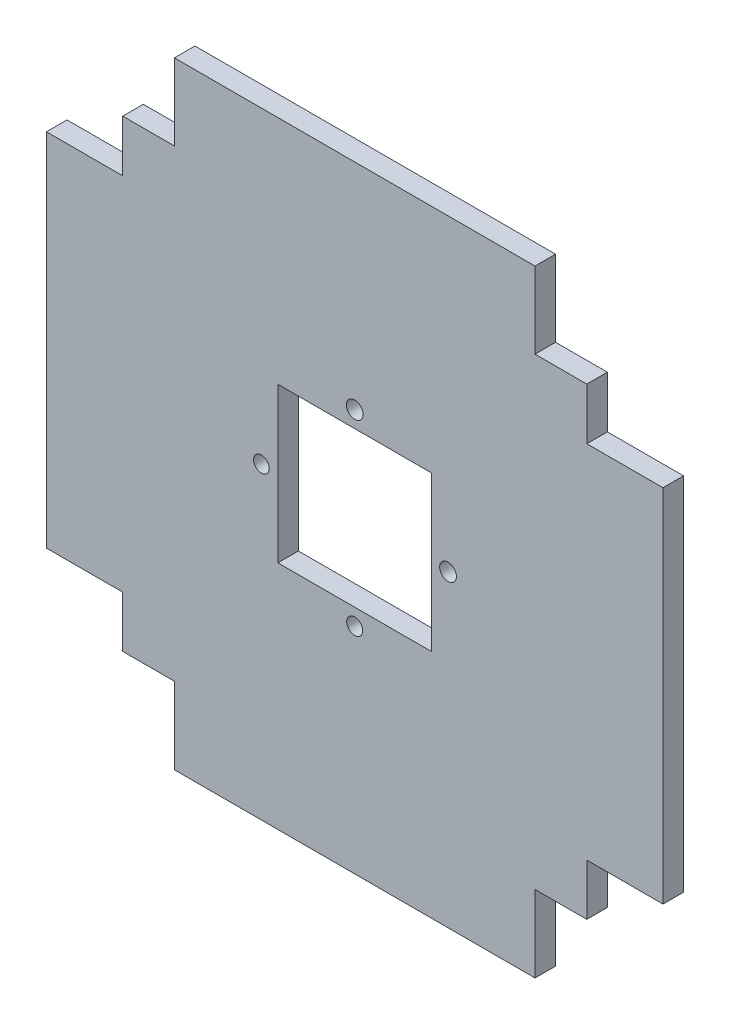
ISO-10303-21;
HEADER;
FILE_DESCRIPTION(('STEP AP214'),'2;1');
FILE_NAME('part.step','',(''),(''),'','','');
FILE_SCHEMA(('AUTOMOTIVE_DESIGN { 1 0 10303 214 1 1 1 1 }'));
ENDSEC;
DATA;
#1=APPLICATION_CONTEXT('core data for automotive mechanical design processes');
#2=APPLICATION_PROTOCOL_DEFINITION('international standard','automotive_design',2000,#1);
#3=PRODUCT_CONTEXT('',#1,'mechanical');
#4=PRODUCT('Part','Part','',(#3));
#5=PRODUCT_RELATED_PRODUCT_CATEGORY('part','',(#4));
#6=PRODUCT_DEFINITION_FORMATION('','',#4);
#7=PRODUCT_DEFINITION_CONTEXT('part definition',#1,'design');
#8=PRODUCT_DEFINITION('design','',#6,#7);
#9=PRODUCT_DEFINITION_SHAPE('','',#8);
#10=(LENGTH_UNIT() NAMED_UNIT(*) SI_UNIT(.MILLI.,.METRE.));
#11=(NAMED_UNIT(*) PLANE_ANGLE_UNIT() SI_UNIT($,.RADIAN.));
#12=(NAMED_UNIT(*) SI_UNIT($,.STERADIAN.) SOLID_ANGLE_UNIT());
#13=UNCERTAINTY_MEASURE_WITH_UNIT(LENGTH_MEASURE(1.E-05),#10,'distance_accuracy_value','');
#14=(GEOMETRIC_REPRESENTATION_CONTEXT(3) GLOBAL_UNCERTAINTY_ASSIGNED_CONTEXT((#13)) GLOBAL_UNIT_ASSIGNED_CONTEXT((#10,
#11,#12)) REPRESENTATION_CONTEXT('',''));
#15=CARTESIAN_POINT('',(0.,0.,0.));
#16=DIRECTION('',(0.,0.,1.));
#17=DIRECTION('',(1.,0.,0.));
#18=AXIS2_PLACEMENT_3D('',#15,#16,#17);
#19=CARTESIAN_POINT('',(0.,0.,5.08));
#20=DIRECTION('',(0.,0.,1.));
#21=DIRECTION('',(1.,0.,0.));
#22=AXIS2_PLACEMENT_3D('',#19,#20,#21);
#23=PLANE('',#22);
#24=CARTESIAN_POINT('',(21.0839098886367,-11.4071856287425,5.08));
#25=DIRECTION('',(0.,0.,1.));
#26=DIRECTION('',(1.,0.,0.));
#27=AXIS2_PLACEMENT_3D('',#24,#25,#26);
#28=CIRCLE('',#27,2.0747905438348);
#29=CARTESIAN_POINT('',(23.1587004324715,-11.4071856287425,5.08));
#30=VERTEX_POINT('',#29);
#31=EDGE_CURVE('E733',#30,#30,#28,.T.);
#32=ORIENTED_EDGE('',*,*,#31,.F.);
#33=EDGE_LOOP('',(#32));
#34=FACE_BOUND('',#33,.T.);
#35=CARTESIAN_POINT('',(-25.0384009066008,-11.4071856287425,5.08));
#36=DIRECTION('',(0.,0.,1.));
#37=DIRECTION('',(1.,0.,0.));
#38=AXIS2_PLACEMENT_3D('',#35,#36,#37);
#39=CIRCLE('',#38,1.93213059452219);
#40=CARTESIAN_POINT('',(-23.1062703120786,-11.4071856287425,5.08));
#41=VERTEX_POINT('',#40);
#42=EDGE_CURVE('E223',#41,#41,#39,.T.);
#43=ORIENTED_EDGE('',*,*,#42,.F.);
#44=EDGE_LOOP('',(#43));
#45=FACE_BOUND('',#44,.T.);
#46=DIRECTION('',(0.,-1.,0.));
#47=VECTOR('',#46,1.);
#48=CARTESIAN_POINT('',(-59.3173652694611,33.1568862275449,5.08));
#49=LINE('',#48,#47);
#50=CARTESIAN_POINT('',(-59.3173652694611,45.9329341317365,5.08));
#51=VERTEX_POINT('',#50);
#52=CARTESIAN_POINT('',(-59.3173652694611,33.1568862275449,5.08));
#53=VERTEX_POINT('',#52);
#54=EDGE_CURVE('E233',#51,#53,#49,.T.);
#55=ORIENTED_EDGE('',*,*,#54,.T.);
#56=DIRECTION('',(-1.,0.,0.));
#57=VECTOR('',#56,1.);
#58=CARTESIAN_POINT('',(-78.1772455089821,33.1568862275449,5.08));
#59=LINE('',#58,#57);
#60=CARTESIAN_POINT('',(-78.1772455089821,33.1568862275449,5.08));
#61=VERTEX_POINT('',#60);
#62=EDGE_CURVE('E236',#53,#61,#59,.T.);
#63=ORIENTED_EDGE('',*,*,#62,.T.);
#64=DIRECTION('',(0.,-1.,0.));
#65=VECTOR('',#64,1.);
#66=CARTESIAN_POINT('',(-78.1772455089821,33.1568862275449,5.08));
#67=LINE('',#66,#65);
#68=CARTESIAN_POINT('',(-78.177245508982,-55.97125748503,5.08));
#69=VERTEX_POINT('',#68);
#70=EDGE_CURVE('E239',#61,#69,#67,.T.);
#71=ORIENTED_EDGE('',*,*,#70,.T.);
#72=DIRECTION('',(1.,0.,0.));
#73=VECTOR('',#72,1.);
#74=CARTESIAN_POINT('',(-78.177245508982,-55.97125748503,5.08));
#75=LINE('',#74,#73);
#76=CARTESIAN_POINT('',(-59.3173652694611,-55.97125748503,5.08));
#77=VERTEX_POINT('',#76);
#78=EDGE_CURVE('E241',#69,#77,#75,.T.);
#79=ORIENTED_EDGE('',*,*,#78,.T.);
#80=DIRECTION('',(0.,-1.,0.));
#81=VECTOR('',#80,1.);
#82=CARTESIAN_POINT('',(-59.3173652694611,-55.97125748503,5.08));
#83=LINE('',#82,#81);
#84=CARTESIAN_POINT('',(-59.3173652694611,-68.6523332378443,5.08));
#85=VERTEX_POINT('',#84);
#86=EDGE_CURVE('E243',#77,#85,#83,.T.);
#87=ORIENTED_EDGE('',*,*,#86,.T.);
#88=DIRECTION('',(1.,0.,0.));
#89=VECTOR('',#88,1.);
#90=CARTESIAN_POINT('',(-46.5413173652695,-68.6523332378443,5.08));
#91=LINE('',#90,#89);
#92=CARTESIAN_POINT('',(-46.5413173652695,-68.6523332378443,5.08));
#93=VERTEX_POINT('',#92);
#94=EDGE_CURVE('E245',#85,#93,#91,.T.);
#95=ORIENTED_EDGE('',*,*,#94,.T.);
#96=DIRECTION('',(0.,-1.,0.));
#97=VECTOR('',#96,1.);
#98=CARTESIAN_POINT('',(-46.5413173652695,-87.6071856287425,5.08));
#99=LINE('',#98,#97);
#100=CARTESIAN_POINT('',(-46.5413173652695,-87.6071856287425,5.08));
#101=VERTEX_POINT('',#100);
#102=EDGE_CURVE('E247',#93,#101,#99,.T.);
#103=ORIENTED_EDGE('',*,*,#102,.T.);
#104=DIRECTION('',(1.,0.,0.));
#105=VECTOR('',#104,1.);
#106=CARTESIAN_POINT('',(-46.5413173652695,-87.6071856287425,5.08));
#107=LINE('',#106,#105);
#108=CARTESIAN_POINT('',(42.5868263473054,-87.6071856287425,5.08));
#109=VERTEX_POINT('',#108);
#110=EDGE_CURVE('E249',#101,#109,#107,.T.);
#111=ORIENTED_EDGE('',*,*,#110,.T.);
#112=DIRECTION('',(0.,1.,0.));
#113=VECTOR('',#112,1.);
#114=CARTESIAN_POINT('',(42.5868263473054,-87.6071856287425,5.08));
#115=LINE('',#114,#113);
#116=CARTESIAN_POINT('',(42.5868263473054,-68.6523332378443,5.08));
#117=VERTEX_POINT('',#116);
#118=EDGE_CURVE('E251',#109,#117,#115,.T.);
#119=ORIENTED_EDGE('',*,*,#118,.T.);
#120=DIRECTION('',(1.,0.,0.));
#121=VECTOR('',#120,1.);
#122=CARTESIAN_POINT('',(42.5868263473054,-68.6523332378443,5.08));
#123=LINE('',#122,#121);
#124=CARTESIAN_POINT('',(55.3889879002395,-68.6523332378443,5.08));
#125=VERTEX_POINT('',#124);
#126=EDGE_CURVE('E253',#117,#125,#123,.T.);
#127=ORIENTED_EDGE('',*,*,#126,.T.);
#128=DIRECTION('',(0.,1.,0.));
#129=VECTOR('',#128,1.);
#130=CARTESIAN_POINT('',(55.3889879002395,-55.97125748503,5.08));
#131=LINE('',#130,#129);
#132=CARTESIAN_POINT('',(55.3889879002395,-55.97125748503,5.08));
#133=VERTEX_POINT('',#132);
#134=EDGE_CURVE('E255',#125,#133,#131,.T.);
#135=ORIENTED_EDGE('',*,*,#134,.T.);
#136=DIRECTION('',(1.,0.,0.));
#137=VECTOR('',#136,1.);
#138=CARTESIAN_POINT('',(74.222754491018,-55.97125748503,5.08));
#139=LINE('',#138,#137);
#140=CARTESIAN_POINT('',(74.222754491018,-55.97125748503,5.08));
#141=VERTEX_POINT('',#140);
#142=EDGE_CURVE('E257',#133,#141,#139,.T.);
#143=ORIENTED_EDGE('',*,*,#142,.T.);
#144=DIRECTION('',(0.,1.,0.));
#145=VECTOR('',#144,1.);
#146=CARTESIAN_POINT('',(74.222754491018,33.1568862275449,5.08));
#147=LINE('',#146,#145);
#148=CARTESIAN_POINT('',(74.222754491018,33.1568862275449,5.08));
#149=VERTEX_POINT('',#148);
#150=EDGE_CURVE('E259',#141,#149,#147,.T.);
#151=ORIENTED_EDGE('',*,*,#150,.T.);
#152=DIRECTION('',(-1.,0.,0.));
#153=VECTOR('',#152,1.);
#154=CARTESIAN_POINT('',(74.222754491018,33.1568862275449,5.08));
#155=LINE('',#154,#153);
#156=CARTESIAN_POINT('',(55.3889879002395,33.1568862275449,5.08));
#157=VERTEX_POINT('',#156);
#158=EDGE_CURVE('E261',#149,#157,#155,.T.);
#159=ORIENTED_EDGE('',*,*,#158,.T.);
#160=DIRECTION('',(0.,1.,0.));
#161=VECTOR('',#160,1.);
#162=CARTESIAN_POINT('',(55.3889879002395,33.1568862275449,5.08));
#163=LINE('',#162,#161);
#164=CARTESIAN_POINT('',(55.3889879002395,45.9329341317365,5.08));
#165=VERTEX_POINT('',#164);
#166=EDGE_CURVE('E263',#157,#165,#163,.T.);
#167=ORIENTED_EDGE('',*,*,#166,.T.);
#168=DIRECTION('',(-1.,0.,0.));
#169=VECTOR('',#168,1.);
#170=CARTESIAN_POINT('',(42.5868263473054,45.9329341317365,5.08));
#171=LINE('',#170,#169);
#172=CARTESIAN_POINT('',(42.5868263473054,45.9329341317365,5.08));
#173=VERTEX_POINT('',#172);
#174=EDGE_CURVE('E265',#165,#173,#171,.T.);
#175=ORIENTED_EDGE('',*,*,#174,.T.);
#176=DIRECTION('',(0.,1.,0.));
#177=VECTOR('',#176,1.);
#178=CARTESIAN_POINT('',(42.5868263473054,64.7928143712575,5.08));
#179=LINE('',#178,#177);
#180=CARTESIAN_POINT('',(42.5868263473054,64.7928143712575,5.08));
#181=VERTEX_POINT('',#180);
#182=EDGE_CURVE('E267',#173,#181,#179,.T.);
#183=ORIENTED_EDGE('',*,*,#182,.T.);
#184=DIRECTION('',(-1.,0.,0.));
#185=VECTOR('',#184,1.);
#186=CARTESIAN_POINT('',(-46.5413173652695,64.7928143712575,5.08));
#187=LINE('',#186,#185);
#188=CARTESIAN_POINT('',(-46.5413173652695,64.7928143712575,5.08));
#189=VERTEX_POINT('',#188);
#190=EDGE_CURVE('E269',#181,#189,#187,.T.);
#191=ORIENTED_EDGE('',*,*,#190,.T.);
#192=DIRECTION('',(0.,-1.,0.));
#193=VECTOR('',#192,1.);
#194=CARTESIAN_POINT('',(-46.5413173652695,64.7928143712575,5.08));
#195=LINE('',#194,#193);
#196=CARTESIAN_POINT('',(-46.5413173652695,45.9329341317365,5.08));
#197=VERTEX_POINT('',#196);
#198=EDGE_CURVE('E271',#189,#197,#195,.T.);
#199=ORIENTED_EDGE('',*,*,#198,.T.);
#200=DIRECTION('',(-1.,0.,0.));
#201=VECTOR('',#200,1.);
#202=CARTESIAN_POINT('',(-46.5413173652695,45.9329341317365,5.08));
#203=LINE('',#202,#201);
#204=EDGE_CURVE('E273',#197,#51,#203,.T.);
#205=ORIENTED_EDGE('',*,*,#204,.T.);
#206=EDGE_LOOP('',(#55,#63,#71,#79,#87,#95,#103,#111,#119,#127,#135,#143,#151,#159,#167,#175,
#183,#191,#199,#205));
#207=FACE_BOUND('',#206,.T.);
#208=DIRECTION('',(-1.,0.,0.));
#209=VECTOR('',#208,1.);
#210=CARTESIAN_POINT('',(-20.9744009066008,7.70580608227633,5.08));
#211=LINE('',#210,#209);
#212=CARTESIAN_POINT('',(17.0199098886367,7.70580608227633,5.08));
#213=VERTEX_POINT('',#212);
#214=CARTESIAN_POINT('',(-20.9744009066008,7.70580608227633,5.08));
#215=VERTEX_POINT('',#214);
#216=EDGE_CURVE('E202',#213,#215,#211,.T.);
#217=ORIENTED_EDGE('',*,*,#216,.F.);
#218=DIRECTION('',(0.,1.,0.));
#219=VECTOR('',#218,1.);
#220=CARTESIAN_POINT('',(17.0199098886367,7.70580608227633,5.08));
#221=LINE('',#220,#219);
#222=CARTESIAN_POINT('',(17.0199098886367,-30.5201773397614,5.08));
#223=VERTEX_POINT('',#222);
#224=EDGE_CURVE('E194',#223,#213,#221,.T.);
#225=ORIENTED_EDGE('',*,*,#224,.F.);
#226=DIRECTION('',(1.,0.,0.));
#227=VECTOR('',#226,1.);
#228=CARTESIAN_POINT('',(-20.9744009066008,-30.5201773397614,5.08));
#229=LINE('',#228,#227);
#230=CARTESIAN_POINT('',(-20.9744009066008,-30.5201773397614,5.08));
#231=VERTEX_POINT('',#230);
#232=EDGE_CURVE('E217',#231,#223,#229,.T.);
#233=ORIENTED_EDGE('',*,*,#232,.F.);
#234=DIRECTION('',(0.,-1.,0.));
#235=VECTOR('',#234,1.);
#236=CARTESIAN_POINT('',(-20.9744009066008,7.70580608227633,5.08));
#237=LINE('',#236,#235);
#238=EDGE_CURVE('E215',#215,#231,#237,.T.);
#239=ORIENTED_EDGE('',*,*,#238,.F.);
#240=EDGE_LOOP('',(#217,#225,#233,#239));
#241=FACE_BOUND('',#240,.T.);
#242=CARTESIAN_POINT('',(-1.97724550898205,11.7698060822763,5.08));
#243=DIRECTION('',(0.,0.,1.));
#244=DIRECTION('',(1.,0.,0.));
#245=AXIS2_PLACEMENT_3D('',#242,#243,#244);
#246=CIRCLE('',#245,2.077751344082);
#247=CARTESIAN_POINT('',(0.100505835099948,11.7698060822763,5.08));
#248=VERTEX_POINT('',#247);
#249=EDGE_CURVE('E739',#248,#248,#246,.T.);
#250=ORIENTED_EDGE('',*,*,#249,.F.);
#251=EDGE_LOOP('',(#250));
#252=FACE_BOUND('',#251,.T.);
#253=CARTESIAN_POINT('',(-1.97724550898205,-34.5841773397614,5.08));
#254=DIRECTION('',(0.,0.,1.));
#255=DIRECTION('',(1.,0.,0.));
#256=AXIS2_PLACEMENT_3D('',#253,#254,#255);
#257=CIRCLE('',#256,1.97724550898205);
#258=CARTESIAN_POINT('',(0.,-34.5841773397614,5.08));
#259=VERTEX_POINT('',#258);
#260=EDGE_CURVE('E724',#259,#259,#257,.T.);
#261=ORIENTED_EDGE('',*,*,#260,.F.);
#262=EDGE_LOOP('',(#261));
#263=FACE_BOUND('',#262,.T.);
#264=ADVANCED_FACE('F33',(#34,#45,#207,#241,#252,#263),#23,.T.);
#265=CARTESIAN_POINT('',(0.,0.,0.));
#266=DIRECTION('',(0.,0.,1.));
#267=DIRECTION('',(1.,0.,0.));
#268=AXIS2_PLACEMENT_3D('',#265,#266,#267);
#269=PLANE('',#268);
#270=DIRECTION('',(0.,-1.,0.));
#271=VECTOR('',#270,1.);
#272=CARTESIAN_POINT('',(-59.3173652694611,33.1568862275449,0.));
#273=LINE('',#272,#271);
#274=CARTESIAN_POINT('',(-59.3173652694611,45.9329341317365,0.));
#275=VERTEX_POINT('',#274);
#276=CARTESIAN_POINT('',(-59.3173652694611,33.1568862275449,0.));
#277=VERTEX_POINT('',#276);
#278=EDGE_CURVE('E210',#275,#277,#273,.T.);
#279=ORIENTED_EDGE('',*,*,#278,.F.);
#280=DIRECTION('',(-1.,0.,0.));
#281=VECTOR('',#280,1.);
#282=CARTESIAN_POINT('',(-46.5413173652695,45.9329341317365,0.));
#283=LINE('',#282,#281);
#284=CARTESIAN_POINT('',(-46.5413173652695,45.9329341317365,0.));
#285=VERTEX_POINT('',#284);
#286=EDGE_CURVE('E237',#285,#275,#283,.T.);
#287=ORIENTED_EDGE('',*,*,#286,.F.);
#288=DIRECTION('',(0.,-1.,0.));
#289=VECTOR('',#288,1.);
#290=CARTESIAN_POINT('',(-46.5413173652695,64.7928143712575,0.));
#291=LINE('',#290,#289);
#292=CARTESIAN_POINT('',(-46.5413173652695,64.7928143712575,0.));
#293=VERTEX_POINT('',#292);
#294=EDGE_CURVE('E312',#293,#285,#291,.T.);
#295=ORIENTED_EDGE('',*,*,#294,.F.);
#296=DIRECTION('',(-1.,0.,0.));
#297=VECTOR('',#296,1.);
#298=CARTESIAN_POINT('',(-46.5413173652695,64.7928143712575,0.));
#299=LINE('',#298,#297);
#300=CARTESIAN_POINT('',(42.5868263473054,64.7928143712575,0.));
#301=VERTEX_POINT('',#300);
#302=EDGE_CURVE('E310',#301,#293,#299,.T.);
#303=ORIENTED_EDGE('',*,*,#302,.F.);
#304=DIRECTION('',(0.,1.,0.));
#305=VECTOR('',#304,1.);
#306=CARTESIAN_POINT('',(42.5868263473054,64.7928143712575,0.));
#307=LINE('',#306,#305);
#308=CARTESIAN_POINT('',(42.5868263473054,45.9329341317365,0.));
#309=VERTEX_POINT('',#308);
#310=EDGE_CURVE('E308',#309,#301,#307,.T.);
#311=ORIENTED_EDGE('',*,*,#310,.F.);
#312=DIRECTION('',(-1.,0.,0.));
#313=VECTOR('',#312,1.);
#314=CARTESIAN_POINT('',(42.5868263473054,45.9329341317365,0.));
#315=LINE('',#314,#313);
#316=CARTESIAN_POINT('',(55.3889879002395,45.9329341317365,0.));
#317=VERTEX_POINT('',#316);
#318=EDGE_CURVE('E306',#317,#309,#315,.T.);
#319=ORIENTED_EDGE('',*,*,#318,.F.);
#320=DIRECTION('',(0.,1.,0.));
#321=VECTOR('',#320,1.);
#322=CARTESIAN_POINT('',(55.3889879002395,33.1568862275449,0.));
#323=LINE('',#322,#321);
#324=CARTESIAN_POINT('',(55.3889879002395,33.1568862275449,0.));
#325=VERTEX_POINT('',#324);
#326=EDGE_CURVE('E304',#325,#317,#323,.T.);
#327=ORIENTED_EDGE('',*,*,#326,.F.);
#328=DIRECTION('',(-1.,0.,0.));
#329=VECTOR('',#328,1.);
#330=CARTESIAN_POINT('',(74.222754491018,33.1568862275449,0.));
#331=LINE('',#330,#329);
#332=CARTESIAN_POINT('',(74.222754491018,33.1568862275449,0.));
#333=VERTEX_POINT('',#332);
#334=EDGE_CURVE('E302',#333,#325,#331,.T.);
#335=ORIENTED_EDGE('',*,*,#334,.F.);
#336=DIRECTION('',(0.,1.,0.));
#337=VECTOR('',#336,1.);
#338=CARTESIAN_POINT('',(74.222754491018,33.1568862275449,0.));
#339=LINE('',#338,#337);
#340=CARTESIAN_POINT('',(74.222754491018,-55.97125748503,0.));
#341=VERTEX_POINT('',#340);
#342=EDGE_CURVE('E300',#341,#333,#339,.T.);
#343=ORIENTED_EDGE('',*,*,#342,.F.);
#344=DIRECTION('',(1.,0.,0.));
#345=VECTOR('',#344,1.);
#346=CARTESIAN_POINT('',(74.222754491018,-55.97125748503,0.));
#347=LINE('',#346,#345);
#348=CARTESIAN_POINT('',(55.3889879002395,-55.97125748503,0.));
#349=VERTEX_POINT('',#348);
#350=EDGE_CURVE('E298',#349,#341,#347,.T.);
#351=ORIENTED_EDGE('',*,*,#350,.F.);
#352=DIRECTION('',(0.,1.,0.));
#353=VECTOR('',#352,1.);
#354=CARTESIAN_POINT('',(55.3889879002395,-55.97125748503,0.));
#355=LINE('',#354,#353);
#356=CARTESIAN_POINT('',(55.3889879002395,-68.6523332378443,0.));
#357=VERTEX_POINT('',#356);
#358=EDGE_CURVE('E296',#357,#349,#355,.T.);
#359=ORIENTED_EDGE('',*,*,#358,.F.);
#360=DIRECTION('',(1.,0.,0.));
#361=VECTOR('',#360,1.);
#362=CARTESIAN_POINT('',(42.5868263473054,-68.6523332378443,0.));
#363=LINE('',#362,#361);
#364=CARTESIAN_POINT('',(42.5868263473054,-68.6523332378443,0.));
#365=VERTEX_POINT('',#364);
#366=EDGE_CURVE('E294',#365,#357,#363,.T.);
#367=ORIENTED_EDGE('',*,*,#366,.F.);
#368=DIRECTION('',(0.,1.,0.));
#369=VECTOR('',#368,1.);
#370=CARTESIAN_POINT('',(42.5868263473054,-87.6071856287425,0.));
#371=LINE('',#370,#369);
#372=CARTESIAN_POINT('',(42.5868263473054,-87.6071856287425,0.));
#373=VERTEX_POINT('',#372);
#374=EDGE_CURVE('E292',#373,#365,#371,.T.);
#375=ORIENTED_EDGE('',*,*,#374,.F.);
#376=DIRECTION('',(1.,0.,0.));
#377=VECTOR('',#376,1.);
#378=CARTESIAN_POINT('',(-46.5413173652695,-87.6071856287425,0.));
#379=LINE('',#378,#377);
#380=CARTESIAN_POINT('',(-46.5413173652695,-87.6071856287425,0.));
#381=VERTEX_POINT('',#380);
#382=EDGE_CURVE('E290',#381,#373,#379,.T.);
#383=ORIENTED_EDGE('',*,*,#382,.F.);
#384=DIRECTION('',(0.,-1.,0.));
#385=VECTOR('',#384,1.);
#386=CARTESIAN_POINT('',(-46.5413173652695,-87.6071856287425,0.));
#387=LINE('',#386,#385);
#388=CARTESIAN_POINT('',(-46.5413173652695,-68.6523332378443,0.));
#389=VERTEX_POINT('',#388);
#390=EDGE_CURVE('E288',#389,#381,#387,.T.);
#391=ORIENTED_EDGE('',*,*,#390,.F.);
#392=DIRECTION('',(1.,0.,0.));
#393=VECTOR('',#392,1.);
#394=CARTESIAN_POINT('',(-46.5413173652695,-68.6523332378443,0.));
#395=LINE('',#394,#393);
#396=CARTESIAN_POINT('',(-59.3173652694611,-68.6523332378443,0.));
#397=VERTEX_POINT('',#396);
#398=EDGE_CURVE('E286',#397,#389,#395,.T.);
#399=ORIENTED_EDGE('',*,*,#398,.F.);
#400=DIRECTION('',(0.,-1.,0.));
#401=VECTOR('',#400,1.);
#402=CARTESIAN_POINT('',(-59.3173652694611,-55.97125748503,0.));
#403=LINE('',#402,#401);
#404=CARTESIAN_POINT('',(-59.3173652694611,-55.97125748503,0.));
#405=VERTEX_POINT('',#404);
#406=EDGE_CURVE('E284',#405,#397,#403,.T.);
#407=ORIENTED_EDGE('',*,*,#406,.F.);
#408=DIRECTION('',(1.,0.,0.));
#409=VECTOR('',#408,1.);
#410=CARTESIAN_POINT('',(-78.177245508982,-55.97125748503,0.));
#411=LINE('',#410,#409);
#412=CARTESIAN_POINT('',(-78.177245508982,-55.97125748503,0.));
#413=VERTEX_POINT('',#412);
#414=EDGE_CURVE('E282',#413,#405,#411,.T.);
#415=ORIENTED_EDGE('',*,*,#414,.F.);
#416=DIRECTION('',(0.,-1.,0.));
#417=VECTOR('',#416,1.);
#418=CARTESIAN_POINT('',(-78.1772455089821,33.1568862275449,0.));
#419=LINE('',#418,#417);
#420=CARTESIAN_POINT('',(-78.1772455089821,33.1568862275449,0.));
#421=VERTEX_POINT('',#420);
#422=EDGE_CURVE('E280',#421,#413,#419,.T.);
#423=ORIENTED_EDGE('',*,*,#422,.F.);
#424=DIRECTION('',(-1.,0.,0.));
#425=VECTOR('',#424,1.);
#426=CARTESIAN_POINT('',(-78.1772455089821,33.1568862275449,0.));
#427=LINE('',#426,#425);
#428=EDGE_CURVE('E278',#277,#421,#427,.T.);
#429=ORIENTED_EDGE('',*,*,#428,.F.);
#430=EDGE_LOOP('',(#279,#287,#295,#303,#311,#319,#327,#335,#343,#351,#359,#367,#375,#383,#391,
#399,#407,#415,#423,#429));
#431=FACE_BOUND('',#430,.T.);
#432=DIRECTION('',(0.,1.,0.));
#433=VECTOR('',#432,1.);
#434=CARTESIAN_POINT('',(17.0199098886367,7.70580608227633,0.));
#435=LINE('',#434,#433);
#436=CARTESIAN_POINT('',(17.0199098886367,-30.5201773397614,0.));
#437=VERTEX_POINT('',#436);
#438=CARTESIAN_POINT('',(17.0199098886367,7.70580608227633,0.));
#439=VERTEX_POINT('',#438);
#440=EDGE_CURVE('E56',#437,#439,#435,.T.);
#441=ORIENTED_EDGE('',*,*,#440,.T.);
#442=DIRECTION('',(-1.,0.,0.));
#443=VECTOR('',#442,1.);
#444=CARTESIAN_POINT('',(-20.9744009066008,7.70580608227633,0.));
#445=LINE('',#444,#443);
#446=CARTESIAN_POINT('',(-20.9744009066008,7.70580608227633,0.));
#447=VERTEX_POINT('',#446);
#448=EDGE_CURVE('E209',#439,#447,#445,.T.);
#449=ORIENTED_EDGE('',*,*,#448,.T.);
#450=DIRECTION('',(0.,-1.,0.));
#451=VECTOR('',#450,1.);
#452=CARTESIAN_POINT('',(-20.9744009066008,7.70580608227633,0.));
#453=LINE('',#452,#451);
#454=CARTESIAN_POINT('',(-20.9744009066008,-30.5201773397614,0.));
#455=VERTEX_POINT('',#454);
#456=EDGE_CURVE('E225',#447,#455,#453,.T.);
#457=ORIENTED_EDGE('',*,*,#456,.T.);
#458=DIRECTION('',(1.,0.,0.));
#459=VECTOR('',#458,1.);
#460=CARTESIAN_POINT('',(-20.9744009066008,-30.5201773397614,0.));
#461=LINE('',#460,#459);
#462=EDGE_CURVE('E203',#455,#437,#461,.T.);
#463=ORIENTED_EDGE('',*,*,#462,.T.);
#464=EDGE_LOOP('',(#441,#449,#457,#463));
#465=FACE_BOUND('',#464,.T.);
#466=CARTESIAN_POINT('',(-25.0384009066008,-11.4071856287425,0.));
#467=DIRECTION('',(0.,0.,1.));
#468=DIRECTION('',(1.,0.,0.));
#469=AXIS2_PLACEMENT_3D('',#466,#467,#468);
#470=CIRCLE('',#469,1.93213059452219);
#471=CARTESIAN_POINT('',(-23.1062703120786,-11.4071856287425,0.));
#472=VERTEX_POINT('',#471);
#473=EDGE_CURVE('E742',#472,#472,#470,.T.);
#474=ORIENTED_EDGE('',*,*,#473,.T.);
#475=EDGE_LOOP('',(#474));
#476=FACE_BOUND('',#475,.T.);
#477=CARTESIAN_POINT('',(-1.97724550898205,11.7698060822763,0.));
#478=DIRECTION('',(0.,0.,1.));
#479=DIRECTION('',(1.,0.,0.));
#480=AXIS2_PLACEMENT_3D('',#477,#478,#479);
#481=CIRCLE('',#480,2.077751344082);
#482=CARTESIAN_POINT('',(0.100505835099948,11.7698060822763,0.));
#483=VERTEX_POINT('',#482);
#484=EDGE_CURVE('E736',#483,#483,#481,.T.);
#485=ORIENTED_EDGE('',*,*,#484,.T.);
#486=EDGE_LOOP('',(#485));
#487=FACE_BOUND('',#486,.T.);
#488=CARTESIAN_POINT('',(21.0839098886367,-11.4071856287425,0.));
#489=DIRECTION('',(0.,0.,1.));
#490=DIRECTION('',(1.,0.,0.));
#491=AXIS2_PLACEMENT_3D('',#488,#489,#490);
#492=CIRCLE('',#491,2.0747905438348);
#493=CARTESIAN_POINT('',(23.1587004324715,-11.4071856287425,0.));
#494=VERTEX_POINT('',#493);
#495=EDGE_CURVE('E730',#494,#494,#492,.T.);
#496=ORIENTED_EDGE('',*,*,#495,.T.);
#497=EDGE_LOOP('',(#496));
#498=FACE_BOUND('',#497,.T.);
#499=CARTESIAN_POINT('',(-1.97724550898205,-34.5841773397614,0.));
#500=DIRECTION('',(0.,0.,1.));
#501=DIRECTION('',(1.,0.,0.));
#502=AXIS2_PLACEMENT_3D('',#499,#500,#501);
#503=CIRCLE('',#502,1.97724550898205);
#504=CARTESIAN_POINT('',(0.,-34.5841773397614,0.));
#505=VERTEX_POINT('',#504);
#506=EDGE_CURVE('E727',#505,#505,#503,.T.);
#507=ORIENTED_EDGE('',*,*,#506,.T.);
#508=EDGE_LOOP('',(#507));
#509=FACE_BOUND('',#508,.T.);
#510=ADVANCED_FACE('F378',(#431,#465,#476,#487,#498,#509),#269,.F.);
#511=CARTESIAN_POINT('',(-59.3173652694611,33.1568862275449,5.08));
#512=DIRECTION('',(1.,0.,0.));
#513=DIRECTION('',(0.,0.,-1.));
#514=AXIS2_PLACEMENT_3D('',#511,#512,#513);
#515=PLANE('',#514);
#516=ORIENTED_EDGE('',*,*,#278,.T.);
#517=DIRECTION('',(0.,0.,-1.));
#518=VECTOR('',#517,1.);
#519=CARTESIAN_POINT('',(-59.3173652694611,33.1568862275449,5.08));
#520=LINE('',#519,#518);
#521=EDGE_CURVE('E11',#53,#277,#520,.T.);
#522=ORIENTED_EDGE('',*,*,#521,.F.);
#523=ORIENTED_EDGE('',*,*,#54,.F.);
#524=DIRECTION('',(0.,0.,-1.));
#525=VECTOR('',#524,1.);
#526=CARTESIAN_POINT('',(-59.3173652694611,45.9329341317365,5.08));
#527=LINE('',#526,#525);
#528=EDGE_CURVE('E275',#51,#275,#527,.T.);
#529=ORIENTED_EDGE('',*,*,#528,.T.);
#530=EDGE_LOOP('',(#516,#522,#523,#529));
#531=FACE_BOUND('',#530,.T.);
#532=ADVANCED_FACE('F35',(#531),#515,.F.);
#533=CARTESIAN_POINT('',(-78.1772455089821,33.1568862275449,5.08));
#534=DIRECTION('',(0.,-1.,0.));
#535=DIRECTION('',(0.,0.,-1.));
#536=AXIS2_PLACEMENT_3D('',#533,#534,#535);
#537=PLANE('',#536);
#538=ORIENTED_EDGE('',*,*,#428,.T.);
#539=DIRECTION('',(0.,0.,-1.));
#540=VECTOR('',#539,1.);
#541=CARTESIAN_POINT('',(-78.1772455089821,33.1568862275449,5.08));
#542=LINE('',#541,#540);
#543=EDGE_CURVE('E41',#61,#421,#542,.T.);
#544=ORIENTED_EDGE('',*,*,#543,.F.);
#545=ORIENTED_EDGE('',*,*,#62,.F.);
#546=ORIENTED_EDGE('',*,*,#521,.T.);
#547=EDGE_LOOP('',(#538,#544,#545,#546));
#548=FACE_BOUND('',#547,.T.);
#549=ADVANCED_FACE('F395',(#548),#537,.F.);
#550=CARTESIAN_POINT('',(-78.1772455089821,33.1568862275449,5.08));
#551=DIRECTION('',(1.,0.,0.));
#552=DIRECTION('',(0.,1.,0.));
#553=AXIS2_PLACEMENT_3D('',#550,#551,#552);
#554=PLANE('',#553);
#555=ORIENTED_EDGE('',*,*,#422,.T.);
#556=DIRECTION('',(0.,0.,-1.));
#557=VECTOR('',#556,1.);
#558=CARTESIAN_POINT('',(-78.177245508982,-55.97125748503,5.08));
#559=LINE('',#558,#557);
#560=EDGE_CURVE('E365',#69,#413,#559,.T.);
#561=ORIENTED_EDGE('',*,*,#560,.F.);
#562=ORIENTED_EDGE('',*,*,#70,.F.);
#563=ORIENTED_EDGE('',*,*,#543,.T.);
#564=EDGE_LOOP('',(#555,#561,#562,#563));
#565=FACE_BOUND('',#564,.T.);
#566=ADVANCED_FACE('F372',(#565),#554,.F.);
#567=CARTESIAN_POINT('',(-78.177245508982,-55.97125748503,5.08));
#568=DIRECTION('',(0.,1.,0.));
#569=DIRECTION('',(0.,0.,1.));
#570=AXIS2_PLACEMENT_3D('',#567,#568,#569);
#571=PLANE('',#570);
#572=ORIENTED_EDGE('',*,*,#414,.T.);
#573=DIRECTION('',(0.,0.,-1.));
#574=VECTOR('',#573,1.);
#575=CARTESIAN_POINT('',(-59.3173652694611,-55.97125748503,5.08));
#576=LINE('',#575,#574);
#577=EDGE_CURVE('E362',#77,#405,#576,.T.);
#578=ORIENTED_EDGE('',*,*,#577,.F.);
#579=ORIENTED_EDGE('',*,*,#78,.F.);
#580=ORIENTED_EDGE('',*,*,#560,.T.);
#581=EDGE_LOOP('',(#572,#578,#579,#580));
#582=FACE_BOUND('',#581,.T.);
#583=ADVANCED_FACE('F384',(#582),#571,.F.);
#584=CARTESIAN_POINT('',(-59.3173652694611,-55.97125748503,5.08));
#585=DIRECTION('',(1.,0.,0.));
#586=DIRECTION('',(0.,0.,-1.));
#587=AXIS2_PLACEMENT_3D('',#584,#585,#586);
#588=PLANE('',#587);
#589=ORIENTED_EDGE('',*,*,#406,.T.);
#590=DIRECTION('',(0.,0.,-1.));
#591=VECTOR('',#590,1.);
#592=CARTESIAN_POINT('',(-59.3173652694611,-68.6523332378443,5.08));
#593=LINE('',#592,#591);
#594=EDGE_CURVE('E359',#85,#397,#593,.T.);
#595=ORIENTED_EDGE('',*,*,#594,.F.);
#596=ORIENTED_EDGE('',*,*,#86,.F.);
#597=ORIENTED_EDGE('',*,*,#577,.T.);
#598=EDGE_LOOP('',(#589,#595,#596,#597));
#599=FACE_BOUND('',#598,.T.);
#600=ADVANCED_FACE('F388',(#599),#588,.F.);
#601=CARTESIAN_POINT('',(-46.5413173652695,-68.6523332378443,5.08));
#602=DIRECTION('',(0.,1.,0.));
#603=DIRECTION('',(0.,0.,1.));
#604=AXIS2_PLACEMENT_3D('',#601,#602,#603);
#605=PLANE('',#604);
#606=ORIENTED_EDGE('',*,*,#398,.T.);
#607=DIRECTION('',(0.,0.,-1.));
#608=VECTOR('',#607,1.);
#609=CARTESIAN_POINT('',(-46.5413173652695,-68.6523332378443,5.08));
#610=LINE('',#609,#608);
#611=EDGE_CURVE('E356',#93,#389,#610,.T.);
#612=ORIENTED_EDGE('',*,*,#611,.F.);
#613=ORIENTED_EDGE('',*,*,#94,.F.);
#614=ORIENTED_EDGE('',*,*,#594,.T.);
#615=EDGE_LOOP('',(#606,#612,#613,#614));
#616=FACE_BOUND('',#615,.T.);
#617=ADVANCED_FACE('F468',(#616),#605,.F.);
#618=CARTESIAN_POINT('',(-46.5413173652695,-87.6071856287425,5.08));
#619=DIRECTION('',(1.,0.,0.));
#620=DIRECTION('',(0.,0.,-1.));
#621=AXIS2_PLACEMENT_3D('',#618,#619,#620);
#622=PLANE('',#621);
#623=ORIENTED_EDGE('',*,*,#390,.T.);
#624=DIRECTION('',(0.,0.,-1.));
#625=VECTOR('',#624,1.);
#626=CARTESIAN_POINT('',(-46.5413173652695,-87.6071856287425,5.08));
#627=LINE('',#626,#625);
#628=EDGE_CURVE('E353',#101,#381,#627,.T.);
#629=ORIENTED_EDGE('',*,*,#628,.F.);
#630=ORIENTED_EDGE('',*,*,#102,.F.);
#631=ORIENTED_EDGE('',*,*,#611,.T.);
#632=EDGE_LOOP('',(#623,#629,#630,#631));
#633=FACE_BOUND('',#632,.T.);
#634=ADVANCED_FACE('F466',(#633),#622,.F.);
#635=CARTESIAN_POINT('',(-46.5413173652695,-87.6071856287425,5.08));
#636=DIRECTION('',(0.,1.,0.));
#637=DIRECTION('',(0.,0.,1.));
#638=AXIS2_PLACEMENT_3D('',#635,#636,#637);
#639=PLANE('',#638);
#640=ORIENTED_EDGE('',*,*,#382,.T.);
#641=DIRECTION('',(0.,0.,-1.));
#642=VECTOR('',#641,1.);
#643=CARTESIAN_POINT('',(42.5868263473054,-87.6071856287425,5.08));
#644=LINE('',#643,#642);
#645=EDGE_CURVE('E350',#109,#373,#644,.T.);
#646=ORIENTED_EDGE('',*,*,#645,.F.);
#647=ORIENTED_EDGE('',*,*,#110,.F.);
#648=ORIENTED_EDGE('',*,*,#628,.T.);
#649=EDGE_LOOP('',(#640,#646,#647,#648));
#650=FACE_BOUND('',#649,.T.);
#651=ADVANCED_FACE('F461',(#650),#639,.F.);
#652=CARTESIAN_POINT('',(42.5868263473054,-87.6071856287425,5.08));
#653=DIRECTION('',(-1.,0.,0.));
#654=DIRECTION('',(0.,0.,1.));
#655=AXIS2_PLACEMENT_3D('',#652,#653,#654);
#656=PLANE('',#655);
#657=ORIENTED_EDGE('',*,*,#374,.T.);
#658=DIRECTION('',(0.,0.,-1.));
#659=VECTOR('',#658,1.);
#660=CARTESIAN_POINT('',(42.5868263473054,-68.6523332378443,5.08));
#661=LINE('',#660,#659);
#662=EDGE_CURVE('E347',#117,#365,#661,.T.);
#663=ORIENTED_EDGE('',*,*,#662,.F.);
#664=ORIENTED_EDGE('',*,*,#118,.F.);
#665=ORIENTED_EDGE('',*,*,#645,.T.);
#666=EDGE_LOOP('',(#657,#663,#664,#665));
#667=FACE_BOUND('',#666,.T.);
#668=ADVANCED_FACE('F456',(#667),#656,.F.);
#669=CARTESIAN_POINT('',(42.5868263473054,-68.6523332378443,5.08));
#670=DIRECTION('',(0.,1.,0.));
#671=DIRECTION('',(0.,0.,1.));
#672=AXIS2_PLACEMENT_3D('',#669,#670,#671);
#673=PLANE('',#672);
#674=ORIENTED_EDGE('',*,*,#366,.T.);
#675=DIRECTION('',(0.,0.,-1.));
#676=VECTOR('',#675,1.);
#677=CARTESIAN_POINT('',(55.3889879002395,-68.6523332378443,5.08));
#678=LINE('',#677,#676);
#679=EDGE_CURVE('E344',#125,#357,#678,.T.);
#680=ORIENTED_EDGE('',*,*,#679,.F.);
#681=ORIENTED_EDGE('',*,*,#126,.F.);
#682=ORIENTED_EDGE('',*,*,#662,.T.);
#683=EDGE_LOOP('',(#674,#680,#681,#682));
#684=FACE_BOUND('',#683,.T.);
#685=ADVANCED_FACE('F452',(#684),#673,.F.);
#686=CARTESIAN_POINT('',(55.3889879002395,-55.97125748503,5.08));
#687=DIRECTION('',(-1.,0.,0.));
#688=DIRECTION('',(0.,0.,1.));
#689=AXIS2_PLACEMENT_3D('',#686,#687,#688);
#690=PLANE('',#689);
#691=ORIENTED_EDGE('',*,*,#358,.T.);
#692=DIRECTION('',(0.,0.,-1.));
#693=VECTOR('',#692,1.);
#694=CARTESIAN_POINT('',(55.3889879002395,-55.97125748503,5.08));
#695=LINE('',#694,#693);
#696=EDGE_CURVE('E341',#133,#349,#695,.T.);
#697=ORIENTED_EDGE('',*,*,#696,.F.);
#698=ORIENTED_EDGE('',*,*,#134,.F.);
#699=ORIENTED_EDGE('',*,*,#679,.T.);
#700=EDGE_LOOP('',(#691,#697,#698,#699));
#701=FACE_BOUND('',#700,.T.);
#702=ADVANCED_FACE('F447',(#701),#690,.F.);
#703=CARTESIAN_POINT('',(74.222754491018,-55.97125748503,5.08));
#704=DIRECTION('',(0.,1.,0.));
#705=DIRECTION('',(0.,0.,1.));
#706=AXIS2_PLACEMENT_3D('',#703,#704,#705);
#707=PLANE('',#706);
#708=ORIENTED_EDGE('',*,*,#350,.T.);
#709=DIRECTION('',(0.,0.,-1.));
#710=VECTOR('',#709,1.);
#711=CARTESIAN_POINT('',(74.222754491018,-55.97125748503,5.08));
#712=LINE('',#711,#710);
#713=EDGE_CURVE('E338',#141,#341,#712,.T.);
#714=ORIENTED_EDGE('',*,*,#713,.F.);
#715=ORIENTED_EDGE('',*,*,#142,.F.);
#716=ORIENTED_EDGE('',*,*,#696,.T.);
#717=EDGE_LOOP('',(#708,#714,#715,#716));
#718=FACE_BOUND('',#717,.T.);
#719=ADVANCED_FACE('F441',(#718),#707,.F.);
#720=CARTESIAN_POINT('',(74.222754491018,33.1568862275449,5.08));
#721=DIRECTION('',(-1.,0.,0.));
#722=DIRECTION('',(0.,0.,1.));
#723=AXIS2_PLACEMENT_3D('',#720,#721,#722);
#724=PLANE('',#723);
#725=ORIENTED_EDGE('',*,*,#342,.T.);
#726=DIRECTION('',(0.,0.,-1.));
#727=VECTOR('',#726,1.);
#728=CARTESIAN_POINT('',(74.222754491018,33.1568862275449,5.08));
#729=LINE('',#728,#727);
#730=EDGE_CURVE('E335',#149,#333,#729,.T.);
#731=ORIENTED_EDGE('',*,*,#730,.F.);
#732=ORIENTED_EDGE('',*,*,#150,.F.);
#733=ORIENTED_EDGE('',*,*,#713,.T.);
#734=EDGE_LOOP('',(#725,#731,#732,#733));
#735=FACE_BOUND('',#734,.T.);
#736=ADVANCED_FACE('F437',(#735),#724,.F.);
#737=CARTESIAN_POINT('',(74.222754491018,33.1568862275449,5.08));
#738=DIRECTION('',(0.,-1.,0.));
#739=DIRECTION('',(0.,0.,-1.));
#740=AXIS2_PLACEMENT_3D('',#737,#738,#739);
#741=PLANE('',#740);
#742=ORIENTED_EDGE('',*,*,#334,.T.);
#743=DIRECTION('',(0.,0.,-1.));
#744=VECTOR('',#743,1.);
#745=CARTESIAN_POINT('',(55.3889879002395,33.1568862275449,5.08));
#746=LINE('',#745,#744);
#747=EDGE_CURVE('E332',#157,#325,#746,.T.);
#748=ORIENTED_EDGE('',*,*,#747,.F.);
#749=ORIENTED_EDGE('',*,*,#158,.F.);
#750=ORIENTED_EDGE('',*,*,#730,.T.);
#751=EDGE_LOOP('',(#742,#748,#749,#750));
#752=FACE_BOUND('',#751,.T.);
#753=ADVANCED_FACE('F432',(#752),#741,.F.);
#754=CARTESIAN_POINT('',(55.3889879002395,33.1568862275449,5.08));
#755=DIRECTION('',(-1.,0.,0.));
#756=DIRECTION('',(0.,0.,1.));
#757=AXIS2_PLACEMENT_3D('',#754,#755,#756);
#758=PLANE('',#757);
#759=ORIENTED_EDGE('',*,*,#326,.T.);
#760=DIRECTION('',(0.,0.,-1.));
#761=VECTOR('',#760,1.);
#762=CARTESIAN_POINT('',(55.3889879002395,45.9329341317365,5.08));
#763=LINE('',#762,#761);
#764=EDGE_CURVE('E329',#165,#317,#763,.T.);
#765=ORIENTED_EDGE('',*,*,#764,.F.);
#766=ORIENTED_EDGE('',*,*,#166,.F.);
#767=ORIENTED_EDGE('',*,*,#747,.T.);
#768=EDGE_LOOP('',(#759,#765,#766,#767));
#769=FACE_BOUND('',#768,.T.);
#770=ADVANCED_FACE('F426',(#769),#758,.F.);
#771=CARTESIAN_POINT('',(42.5868263473054,45.9329341317365,5.08));
#772=DIRECTION('',(0.,-1.,0.));
#773=DIRECTION('',(0.,0.,-1.));
#774=AXIS2_PLACEMENT_3D('',#771,#772,#773);
#775=PLANE('',#774);
#776=ORIENTED_EDGE('',*,*,#318,.T.);
#777=DIRECTION('',(0.,0.,-1.));
#778=VECTOR('',#777,1.);
#779=CARTESIAN_POINT('',(42.5868263473054,45.9329341317365,5.08));
#780=LINE('',#779,#778);
#781=EDGE_CURVE('E326',#173,#309,#780,.T.);
#782=ORIENTED_EDGE('',*,*,#781,.F.);
#783=ORIENTED_EDGE('',*,*,#174,.F.);
#784=ORIENTED_EDGE('',*,*,#764,.T.);
#785=EDGE_LOOP('',(#776,#782,#783,#784));
#786=FACE_BOUND('',#785,.T.);
#787=ADVANCED_FACE('F422',(#786),#775,.F.);
#788=CARTESIAN_POINT('',(42.5868263473054,64.7928143712575,5.08));
#789=DIRECTION('',(-1.,0.,0.));
#790=DIRECTION('',(0.,0.,1.));
#791=AXIS2_PLACEMENT_3D('',#788,#789,#790);
#792=PLANE('',#791);
#793=ORIENTED_EDGE('',*,*,#310,.T.);
#794=DIRECTION('',(0.,0.,-1.));
#795=VECTOR('',#794,1.);
#796=CARTESIAN_POINT('',(42.5868263473054,64.7928143712575,5.08));
#797=LINE('',#796,#795);
#798=EDGE_CURVE('E323',#181,#301,#797,.T.);
#799=ORIENTED_EDGE('',*,*,#798,.F.);
#800=ORIENTED_EDGE('',*,*,#182,.F.);
#801=ORIENTED_EDGE('',*,*,#781,.T.);
#802=EDGE_LOOP('',(#793,#799,#800,#801));
#803=FACE_BOUND('',#802,.T.);
#804=ADVANCED_FACE('F417',(#803),#792,.F.);
#805=CARTESIAN_POINT('',(-46.5413173652695,64.7928143712575,5.08));
#806=DIRECTION('',(0.,-1.,0.));
#807=DIRECTION('',(0.,0.,-1.));
#808=AXIS2_PLACEMENT_3D('',#805,#806,#807);
#809=PLANE('',#808);
#810=ORIENTED_EDGE('',*,*,#302,.T.);
#811=DIRECTION('',(0.,0.,-1.));
#812=VECTOR('',#811,1.);
#813=CARTESIAN_POINT('',(-46.5413173652695,64.7928143712575,5.08));
#814=LINE('',#813,#812);
#815=EDGE_CURVE('E320',#189,#293,#814,.T.);
#816=ORIENTED_EDGE('',*,*,#815,.F.);
#817=ORIENTED_EDGE('',*,*,#190,.F.);
#818=ORIENTED_EDGE('',*,*,#798,.T.);
#819=EDGE_LOOP('',(#810,#816,#817,#818));
#820=FACE_BOUND('',#819,.T.);
#821=ADVANCED_FACE('F411',(#820),#809,.F.);
#822=CARTESIAN_POINT('',(-46.5413173652695,64.7928143712575,5.08));
#823=DIRECTION('',(1.,0.,0.));
#824=DIRECTION('',(0.,0.,-1.));
#825=AXIS2_PLACEMENT_3D('',#822,#823,#824);
#826=PLANE('',#825);
#827=ORIENTED_EDGE('',*,*,#294,.T.);
#828=DIRECTION('',(0.,0.,-1.));
#829=VECTOR('',#828,1.);
#830=CARTESIAN_POINT('',(-46.5413173652695,45.9329341317365,5.08));
#831=LINE('',#830,#829);
#832=EDGE_CURVE('E317',#197,#285,#831,.T.);
#833=ORIENTED_EDGE('',*,*,#832,.F.);
#834=ORIENTED_EDGE('',*,*,#198,.F.);
#835=ORIENTED_EDGE('',*,*,#815,.T.);
#836=EDGE_LOOP('',(#827,#833,#834,#835));
#837=FACE_BOUND('',#836,.T.);
#838=ADVANCED_FACE('F407',(#837),#826,.F.);
#839=CARTESIAN_POINT('',(-46.5413173652695,45.9329341317365,5.08));
#840=DIRECTION('',(0.,-1.,0.));
#841=DIRECTION('',(0.,0.,-1.));
#842=AXIS2_PLACEMENT_3D('',#839,#840,#841);
#843=PLANE('',#842);
#844=ORIENTED_EDGE('',*,*,#286,.T.);
#845=ORIENTED_EDGE('',*,*,#528,.F.);
#846=ORIENTED_EDGE('',*,*,#204,.F.);
#847=ORIENTED_EDGE('',*,*,#832,.T.);
#848=EDGE_LOOP('',(#844,#845,#846,#847));
#849=FACE_BOUND('',#848,.T.);
#850=ADVANCED_FACE('F402',(#849),#843,.F.);
#851=CARTESIAN_POINT('',(17.0199098886367,7.70580608227633,5.08));
#852=DIRECTION('',(-1.,0.,0.));
#853=DIRECTION('',(0.,0.,1.));
#854=AXIS2_PLACEMENT_3D('',#851,#852,#853);
#855=PLANE('',#854);
#856=ORIENTED_EDGE('',*,*,#440,.F.);
#857=DIRECTION('',(0.,0.,-1.));
#858=VECTOR('',#857,1.);
#859=CARTESIAN_POINT('',(17.0199098886367,-30.5201773397614,5.08));
#860=LINE('',#859,#858);
#861=EDGE_CURVE('E198',#223,#437,#860,.T.);
#862=ORIENTED_EDGE('',*,*,#861,.F.);
#863=ORIENTED_EDGE('',*,*,#224,.T.);
#864=DIRECTION('',(0.,0.,-1.));
#865=VECTOR('',#864,1.);
#866=CARTESIAN_POINT('',(17.0199098886367,7.70580608227633,5.08));
#867=LINE('',#866,#865);
#868=EDGE_CURVE('E197',#213,#439,#867,.T.);
#869=ORIENTED_EDGE('',*,*,#868,.T.);
#870=EDGE_LOOP('',(#856,#862,#863,#869));
#871=FACE_BOUND('',#870,.T.);
#872=ADVANCED_FACE('F196',(#871),#855,.T.);
#873=CARTESIAN_POINT('',(-20.9744009066008,7.70580608227633,5.08));
#874=DIRECTION('',(0.,-1.,0.));
#875=DIRECTION('',(0.,0.,-1.));
#876=AXIS2_PLACEMENT_3D('',#873,#874,#875);
#877=PLANE('',#876);
#878=ORIENTED_EDGE('',*,*,#448,.F.);
#879=ORIENTED_EDGE('',*,*,#868,.F.);
#880=ORIENTED_EDGE('',*,*,#216,.T.);
#881=DIRECTION('',(0.,0.,-1.));
#882=VECTOR('',#881,1.);
#883=CARTESIAN_POINT('',(-20.9744009066008,7.70580608227633,5.08));
#884=LINE('',#883,#882);
#885=EDGE_CURVE('E211',#215,#447,#884,.T.);
#886=ORIENTED_EDGE('',*,*,#885,.T.);
#887=EDGE_LOOP('',(#878,#879,#880,#886));
#888=FACE_BOUND('',#887,.T.);
#889=ADVANCED_FACE('F206',(#888),#877,.T.);
#890=CARTESIAN_POINT('',(-20.9744009066008,7.70580608227633,5.08));
#891=DIRECTION('',(1.,0.,0.));
#892=DIRECTION('',(0.,0.,-1.));
#893=AXIS2_PLACEMENT_3D('',#890,#891,#892);
#894=PLANE('',#893);
#895=ORIENTED_EDGE('',*,*,#456,.F.);
#896=ORIENTED_EDGE('',*,*,#885,.F.);
#897=ORIENTED_EDGE('',*,*,#238,.T.);
#898=DIRECTION('',(0.,0.,-1.));
#899=VECTOR('',#898,1.);
#900=CARTESIAN_POINT('',(-20.9744009066008,-30.5201773397614,5.08));
#901=LINE('',#900,#899);
#902=EDGE_CURVE('E48',#231,#455,#901,.T.);
#903=ORIENTED_EDGE('',*,*,#902,.T.);
#904=EDGE_LOOP('',(#895,#896,#897,#903));
#905=FACE_BOUND('',#904,.T.);
#906=ADVANCED_FACE('F577',(#905),#894,.T.);
#907=CARTESIAN_POINT('',(-20.9744009066008,-30.5201773397614,5.08));
#908=DIRECTION('',(0.,1.,0.));
#909=DIRECTION('',(0.,0.,1.));
#910=AXIS2_PLACEMENT_3D('',#907,#908,#909);
#911=PLANE('',#910);
#912=ORIENTED_EDGE('',*,*,#462,.F.);
#913=ORIENTED_EDGE('',*,*,#902,.F.);
#914=ORIENTED_EDGE('',*,*,#232,.T.);
#915=ORIENTED_EDGE('',*,*,#861,.T.);
#916=EDGE_LOOP('',(#912,#913,#914,#915));
#917=FACE_BOUND('',#916,.T.);
#918=ADVANCED_FACE('F583',(#917),#911,.T.);
#919=CARTESIAN_POINT('',(-25.0384009066008,-11.4071856287425,5.08));
#920=DIRECTION('',(0.,0.,-1.));
#921=DIRECTION('',(-1.,0.,0.));
#922=AXIS2_PLACEMENT_3D('',#919,#920,#921);
#923=CYLINDRICAL_SURFACE('',#922,1.93213059452219);
#924=ORIENTED_EDGE('',*,*,#42,.T.);
#925=EDGE_LOOP('',(#924));
#926=FACE_BOUND('',#925,.T.);
#927=ORIENTED_EDGE('',*,*,#473,.F.);
#928=EDGE_LOOP('',(#927));
#929=FACE_BOUND('',#928,.T.);
#930=ADVANCED_FACE('F591',(#926,#929),#923,.F.);
#931=CARTESIAN_POINT('',(-1.97724550898205,11.7698060822763,5.08));
#932=DIRECTION('',(0.,0.,-1.));
#933=DIRECTION('',(-1.,0.,0.));
#934=AXIS2_PLACEMENT_3D('',#931,#932,#933);
#935=CYLINDRICAL_SURFACE('',#934,2.077751344082);
#936=ORIENTED_EDGE('',*,*,#249,.T.);
#937=EDGE_LOOP('',(#936));
#938=FACE_BOUND('',#937,.T.);
#939=ORIENTED_EDGE('',*,*,#484,.F.);
#940=EDGE_LOOP('',(#939));
#941=FACE_BOUND('',#940,.T.);
#942=ADVANCED_FACE('F598',(#938,#941),#935,.F.);
#943=CARTESIAN_POINT('',(21.0839098886367,-11.4071856287425,5.08));
#944=DIRECTION('',(0.,0.,-1.));
#945=DIRECTION('',(-1.,0.,0.));
#946=AXIS2_PLACEMENT_3D('',#943,#944,#945);
#947=CYLINDRICAL_SURFACE('',#946,2.0747905438348);
#948=ORIENTED_EDGE('',*,*,#31,.T.);
#949=EDGE_LOOP('',(#948));
#950=FACE_BOUND('',#949,.T.);
#951=ORIENTED_EDGE('',*,*,#495,.F.);
#952=EDGE_LOOP('',(#951));
#953=FACE_BOUND('',#952,.T.);
#954=ADVANCED_FACE('F606',(#950,#953),#947,.F.);
#955=CARTESIAN_POINT('',(-1.97724550898205,-34.5841773397614,5.08));
#956=DIRECTION('',(0.,0.,-1.));
#957=DIRECTION('',(-1.,0.,0.));
#958=AXIS2_PLACEMENT_3D('',#955,#956,#957);
#959=CYLINDRICAL_SURFACE('',#958,1.97724550898205);
#960=ORIENTED_EDGE('',*,*,#260,.T.);
#961=EDGE_LOOP('',(#960));
#962=FACE_BOUND('',#961,.T.);
#963=ORIENTED_EDGE('',*,*,#506,.F.);
#964=EDGE_LOOP('',(#963));
#965=FACE_BOUND('',#964,.T.);
#966=ADVANCED_FACE('F614',(#962,#965),#959,.F.);
#967=CLOSED_SHELL('',(#264,#510,#532,#549,#566,#583,#600,#617,#634,#651,#668,#685,#702,#719,
#736,#753,#770,#787,#804,#821,#838,#850,#872,#889,#906,#918,#930,#942,#954,#966));
#968=MANIFOLD_SOLID_BREP('B2',#967);
#969=ADVANCED_BREP_SHAPE_REPRESENTATION('',(#18,#968),#14);
#970=SHAPE_DEFINITION_REPRESENTATION(#9,#969);
ENDSEC;
END-ISO-10303-21;
